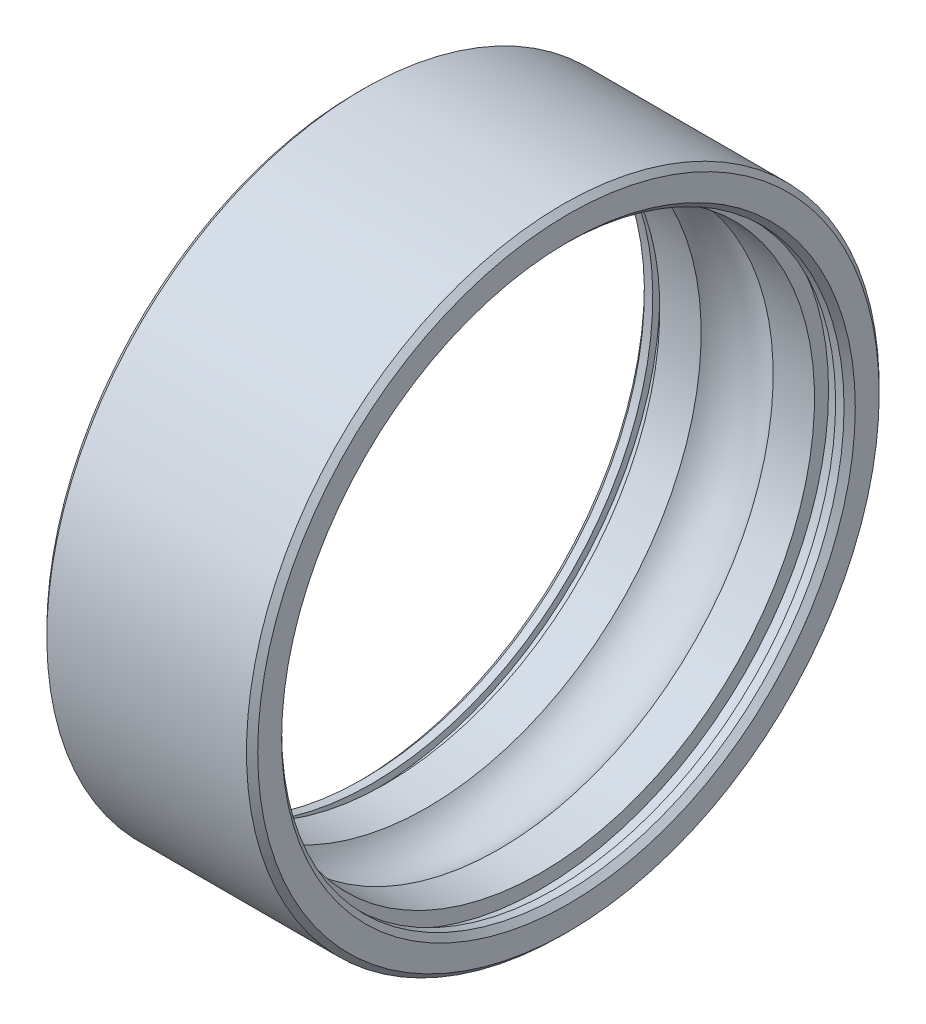
ISO-10303-21;
HEADER;
FILE_DESCRIPTION(('STEP AP214'),'2;1');
FILE_NAME('part.step','',(''),(''),'','','');
FILE_SCHEMA(('AUTOMOTIVE_DESIGN { 1 0 10303 214 1 1 1 1 }'));
ENDSEC;
DATA;
#1=APPLICATION_CONTEXT('core data for automotive mechanical design processes');
#2=APPLICATION_PROTOCOL_DEFINITION('international standard','automotive_design',2000,#1);
#3=PRODUCT_CONTEXT('',#1,'mechanical');
#4=PRODUCT('Part','Part','',(#3));
#5=PRODUCT_RELATED_PRODUCT_CATEGORY('part','',(#4));
#6=PRODUCT_DEFINITION_FORMATION('','',#4);
#7=PRODUCT_DEFINITION_CONTEXT('part definition',#1,'design');
#8=PRODUCT_DEFINITION('design','',#6,#7);
#9=PRODUCT_DEFINITION_SHAPE('','',#8);
#10=(LENGTH_UNIT() NAMED_UNIT(*) SI_UNIT(.MILLI.,.METRE.));
#11=(NAMED_UNIT(*) PLANE_ANGLE_UNIT() SI_UNIT($,.RADIAN.));
#12=(NAMED_UNIT(*) SI_UNIT($,.STERADIAN.) SOLID_ANGLE_UNIT());
#13=UNCERTAINTY_MEASURE_WITH_UNIT(LENGTH_MEASURE(1.E-05),#10,'distance_accuracy_value','');
#14=(GEOMETRIC_REPRESENTATION_CONTEXT(3) GLOBAL_UNCERTAINTY_ASSIGNED_CONTEXT((#13)) GLOBAL_UNIT_ASSIGNED_CONTEXT((#10,
#11,#12)) REPRESENTATION_CONTEXT('',''));
#15=CARTESIAN_POINT('',(0.,0.,0.));
#16=DIRECTION('',(0.,0.,1.));
#17=DIRECTION('',(1.,0.,0.));
#18=AXIS2_PLACEMENT_3D('',#15,#16,#17);
#19=CARTESIAN_POINT('',(1.3,-4.09999999999999,0.));
#20=DIRECTION('',(-1.,0.,0.));
#21=DIRECTION('',(0.,-1.,0.));
#22=AXIS2_PLACEMENT_3D('',#19,#20,#21);
#23=PLANE('',#22);
#24=CARTESIAN_POINT('',(1.3,0.,0.));
#25=DIRECTION('',(-1.,0.,0.));
#26=DIRECTION('',(0.,-1.,0.));
#27=AXIS2_PLACEMENT_3D('',#24,#25,#26);
#28=CIRCLE('',#27,4.09999999999999);
#29=CARTESIAN_POINT('',(1.3,-4.09999999999999,0.));
#30=VERTEX_POINT('',#29);
#31=EDGE_CURVE('E67',#30,#30,#28,.T.);
#32=ORIENTED_EDGE('',*,*,#31,.T.);
#33=EDGE_LOOP('',(#32));
#34=FACE_BOUND('',#33,.T.);
#35=CARTESIAN_POINT('',(1.3,0.,0.));
#36=DIRECTION('',(-1.,0.,0.));
#37=DIRECTION('',(0.,-1.,0.));
#38=AXIS2_PLACEMENT_3D('',#35,#36,#37);
#39=CIRCLE('',#38,4.);
#40=CARTESIAN_POINT('',(1.3,-4.,0.));
#41=VERTEX_POINT('',#40);
#42=EDGE_CURVE('E94',#41,#41,#39,.T.);
#43=ORIENTED_EDGE('',*,*,#42,.F.);
#44=EDGE_LOOP('',(#43));
#45=FACE_BOUND('',#44,.T.);
#46=ADVANCED_FACE('F35',(#34,#45),#23,.T.);
#47=CARTESIAN_POINT('',(-6.42901749222422,0.,0.));
#48=DIRECTION('',(-1.,0.,0.));
#49=DIRECTION('',(0.,-1.,0.));
#50=AXIS2_PLACEMENT_3D('',#47,#48,#49);
#51=CYLINDRICAL_SURFACE('',#50,4.1);
#52=CARTESIAN_POINT('',(1.1,0.,0.));
#53=DIRECTION('',(-1.,0.,0.));
#54=DIRECTION('',(0.,-1.,0.));
#55=AXIS2_PLACEMENT_3D('',#52,#53,#54);
#56=CIRCLE('',#55,4.1);
#57=CARTESIAN_POINT('',(1.1,-4.1,0.));
#58=VERTEX_POINT('',#57);
#59=EDGE_CURVE('E70',#58,#58,#56,.T.);
#60=ORIENTED_EDGE('',*,*,#59,.T.);
#61=EDGE_LOOP('',(#60));
#62=FACE_BOUND('',#61,.T.);
#63=ORIENTED_EDGE('',*,*,#31,.F.);
#64=EDGE_LOOP('',(#63));
#65=FACE_BOUND('',#64,.T.);
#66=ADVANCED_FACE('F101',(#62,#65),#51,.F.);
#67=CARTESIAN_POINT('',(1.1,-3.9,0.));
#68=DIRECTION('',(1.,0.,0.));
#69=DIRECTION('',(0.,1.,0.));
#70=AXIS2_PLACEMENT_3D('',#67,#68,#69);
#71=PLANE('',#70);
#72=CARTESIAN_POINT('',(1.1,0.,0.));
#73=DIRECTION('',(-1.,0.,0.));
#74=DIRECTION('',(0.,-1.,0.));
#75=AXIS2_PLACEMENT_3D('',#72,#73,#74);
#76=CIRCLE('',#75,3.9);
#77=CARTESIAN_POINT('',(1.1,-3.9,0.));
#78=VERTEX_POINT('',#77);
#79=EDGE_CURVE('E73',#78,#78,#76,.T.);
#80=ORIENTED_EDGE('',*,*,#79,.T.);
#81=EDGE_LOOP('',(#80));
#82=FACE_BOUND('',#81,.T.);
#83=ORIENTED_EDGE('',*,*,#59,.F.);
#84=EDGE_LOOP('',(#83));
#85=FACE_BOUND('',#84,.T.);
#86=ADVANCED_FACE('F107',(#82,#85),#71,.T.);
#87=CARTESIAN_POINT('',(-6.42901749222422,0.,0.));
#88=DIRECTION('',(-1.,0.,0.));
#89=DIRECTION('',(0.,-1.,0.));
#90=AXIS2_PLACEMENT_3D('',#87,#88,#89);
#91=CYLINDRICAL_SURFACE('',#90,3.9);
#92=CARTESIAN_POINT('',(0.512347538297978,0.,0.));
#93=DIRECTION('',(-1.,0.,0.));
#94=DIRECTION('',(0.,-1.,0.));
#95=AXIS2_PLACEMENT_3D('',#92,#93,#94);
#96=CIRCLE('',#95,3.9);
#97=CARTESIAN_POINT('',(0.512347538297979,-3.9,0.));
#98=VERTEX_POINT('',#97);
#99=EDGE_CURVE('E76',#98,#98,#96,.T.);
#100=ORIENTED_EDGE('',*,*,#99,.T.);
#101=EDGE_LOOP('',(#100));
#102=FACE_BOUND('',#101,.T.);
#103=ORIENTED_EDGE('',*,*,#79,.F.);
#104=EDGE_LOOP('',(#103));
#105=FACE_BOUND('',#104,.T.);
#106=ADVANCED_FACE('F169',(#102,#105),#91,.F.);
#107=CARTESIAN_POINT('',(0.,0.,0.));
#108=DIRECTION('',(-1.,0.,0.));
#109=DIRECTION('',(0.,-1.,0.));
#110=AXIS2_PLACEMENT_3D('',#107,#108,#109);
#111=TOROIDAL_SURFACE('',#110,3.5,0.65);
#112=CARTESIAN_POINT('',(-0.51234753829798,0.,0.));
#113=DIRECTION('',(-1.,0.,0.));
#114=DIRECTION('',(0.,-1.,0.));
#115=AXIS2_PLACEMENT_3D('',#112,#113,#114);
#116=CIRCLE('',#115,3.9);
#117=CARTESIAN_POINT('',(-0.512347538297979,-3.9,0.));
#118=VERTEX_POINT('',#117);
#119=EDGE_CURVE('E79',#118,#118,#116,.T.);
#120=ORIENTED_EDGE('',*,*,#119,.T.);
#121=EDGE_LOOP('',(#120));
#122=FACE_BOUND('',#121,.T.);
#123=ORIENTED_EDGE('',*,*,#99,.F.);
#124=EDGE_LOOP('',(#123));
#125=FACE_BOUND('',#124,.T.);
#126=ADVANCED_FACE('F165',(#122,#125),#111,.F.);
#127=CARTESIAN_POINT('',(-6.42901749222422,0.,0.));
#128=DIRECTION('',(-1.,0.,0.));
#129=DIRECTION('',(0.,-1.,0.));
#130=AXIS2_PLACEMENT_3D('',#127,#128,#129);
#131=CYLINDRICAL_SURFACE('',#130,3.9);
#132=CARTESIAN_POINT('',(-1.1,0.,0.));
#133=DIRECTION('',(-1.,0.,0.));
#134=DIRECTION('',(0.,-1.,0.));
#135=AXIS2_PLACEMENT_3D('',#132,#133,#134);
#136=CIRCLE('',#135,3.9);
#137=CARTESIAN_POINT('',(-1.1,-3.9,0.));
#138=VERTEX_POINT('',#137);
#139=EDGE_CURVE('E82',#138,#138,#136,.T.);
#140=ORIENTED_EDGE('',*,*,#139,.T.);
#141=EDGE_LOOP('',(#140));
#142=FACE_BOUND('',#141,.T.);
#143=ORIENTED_EDGE('',*,*,#119,.F.);
#144=EDGE_LOOP('',(#143));
#145=FACE_BOUND('',#144,.T.);
#146=ADVANCED_FACE('F161',(#142,#145),#131,.F.);
#147=CARTESIAN_POINT('',(-1.1,-3.9,0.));
#148=DIRECTION('',(-1.,0.,0.));
#149=DIRECTION('',(0.,-1.,0.));
#150=AXIS2_PLACEMENT_3D('',#147,#148,#149);
#151=PLANE('',#150);
#152=CARTESIAN_POINT('',(-1.1,0.,0.));
#153=DIRECTION('',(-1.,0.,0.));
#154=DIRECTION('',(0.,-1.,0.));
#155=AXIS2_PLACEMENT_3D('',#152,#153,#154);
#156=CIRCLE('',#155,4.1);
#157=CARTESIAN_POINT('',(-1.1,-4.1,0.));
#158=VERTEX_POINT('',#157);
#159=EDGE_CURVE('E85',#158,#158,#156,.T.);
#160=ORIENTED_EDGE('',*,*,#159,.T.);
#161=EDGE_LOOP('',(#160));
#162=FACE_BOUND('',#161,.T.);
#163=ORIENTED_EDGE('',*,*,#139,.F.);
#164=EDGE_LOOP('',(#163));
#165=FACE_BOUND('',#164,.T.);
#166=ADVANCED_FACE('F157',(#162,#165),#151,.T.);
#167=CARTESIAN_POINT('',(-6.42901749222422,0.,0.));
#168=DIRECTION('',(-1.,0.,0.));
#169=DIRECTION('',(0.,-1.,0.));
#170=AXIS2_PLACEMENT_3D('',#167,#168,#169);
#171=CYLINDRICAL_SURFACE('',#170,4.1);
#172=CARTESIAN_POINT('',(-1.3,0.,0.));
#173=DIRECTION('',(-1.,0.,0.));
#174=DIRECTION('',(0.,-1.,0.));
#175=AXIS2_PLACEMENT_3D('',#172,#173,#174);
#176=CIRCLE('',#175,4.09999999999999);
#177=CARTESIAN_POINT('',(-1.3,-4.09999999999999,0.));
#178=VERTEX_POINT('',#177);
#179=EDGE_CURVE('E88',#178,#178,#176,.T.);
#180=ORIENTED_EDGE('',*,*,#179,.T.);
#181=EDGE_LOOP('',(#180));
#182=FACE_BOUND('',#181,.T.);
#183=ORIENTED_EDGE('',*,*,#159,.F.);
#184=EDGE_LOOP('',(#183));
#185=FACE_BOUND('',#184,.T.);
#186=ADVANCED_FACE('F153',(#182,#185),#171,.F.);
#187=CARTESIAN_POINT('',(-1.3,-4.09999999999999,0.));
#188=DIRECTION('',(1.,0.,0.));
#189=DIRECTION('',(0.,1.,0.));
#190=AXIS2_PLACEMENT_3D('',#187,#188,#189);
#191=PLANE('',#190);
#192=CARTESIAN_POINT('',(-1.3,0.,0.));
#193=DIRECTION('',(-1.,0.,0.));
#194=DIRECTION('',(0.,-1.,0.));
#195=AXIS2_PLACEMENT_3D('',#192,#193,#194);
#196=CIRCLE('',#195,4.);
#197=CARTESIAN_POINT('',(-1.3,-4.,0.));
#198=VERTEX_POINT('',#197);
#199=EDGE_CURVE('E91',#198,#198,#196,.T.);
#200=ORIENTED_EDGE('',*,*,#199,.T.);
#201=EDGE_LOOP('',(#200));
#202=FACE_BOUND('',#201,.T.);
#203=ORIENTED_EDGE('',*,*,#179,.F.);
#204=EDGE_LOOP('',(#203));
#205=FACE_BOUND('',#204,.T.);
#206=ADVANCED_FACE('F149',(#202,#205),#191,.T.);
#207=CARTESIAN_POINT('',(-6.42901749222422,0.,0.));
#208=DIRECTION('',(-1.,0.,0.));
#209=DIRECTION('',(0.,-1.,0.));
#210=AXIS2_PLACEMENT_3D('',#207,#208,#209);
#211=CYLINDRICAL_SURFACE('',#210,4.);
#212=CARTESIAN_POINT('',(-1.42,0.,0.));
#213=DIRECTION('',(-1.,0.,0.));
#214=DIRECTION('',(0.,-1.,0.));
#215=AXIS2_PLACEMENT_3D('',#212,#213,#214);
#216=CIRCLE('',#215,4.);
#217=CARTESIAN_POINT('',(-1.42,-4.,0.));
#218=VERTEX_POINT('',#217);
#219=EDGE_CURVE('E55',#218,#218,#216,.T.);
#220=ORIENTED_EDGE('',*,*,#219,.T.);
#221=EDGE_LOOP('',(#220));
#222=FACE_BOUND('',#221,.T.);
#223=ORIENTED_EDGE('',*,*,#199,.F.);
#224=EDGE_LOOP('',(#223));
#225=FACE_BOUND('',#224,.T.);
#226=ADVANCED_FACE('F145',(#222,#225),#211,.F.);
#227=CARTESIAN_POINT('',(-1.5,-4.,0.));
#228=DIRECTION('',(-1.,0.,0.));
#229=DIRECTION('',(0.,-1.,0.));
#230=AXIS2_PLACEMENT_3D('',#227,#228,#229);
#231=PLANE('',#230);
#232=CARTESIAN_POINT('',(-1.5,0.,0.));
#233=DIRECTION('',(-1.,0.,0.));
#234=DIRECTION('',(0.,-1.,0.));
#235=AXIS2_PLACEMENT_3D('',#232,#233,#234);
#236=CIRCLE('',#235,4.08);
#237=CARTESIAN_POINT('',(-1.5,-4.07999999999999,0.));
#238=VERTEX_POINT('',#237);
#239=EDGE_CURVE('E46',#238,#238,#236,.F.);
#240=ORIENTED_EDGE('',*,*,#239,.T.);
#241=EDGE_LOOP('',(#240));
#242=FACE_BOUND('',#241,.T.);
#243=CARTESIAN_POINT('',(-1.5,0.,0.));
#244=DIRECTION('',(-1.,0.,0.));
#245=DIRECTION('',(0.,-1.,0.));
#246=AXIS2_PLACEMENT_3D('',#243,#244,#245);
#247=CIRCLE('',#246,4.42);
#248=CARTESIAN_POINT('',(-1.5,-4.42,0.));
#249=VERTEX_POINT('',#248);
#250=EDGE_CURVE('E50',#249,#249,#247,.T.);
#251=ORIENTED_EDGE('',*,*,#250,.T.);
#252=EDGE_LOOP('',(#251));
#253=FACE_BOUND('',#252,.T.);
#254=ADVANCED_FACE('F140',(#242,#253),#231,.T.);
#255=CARTESIAN_POINT('',(-6.42901749222422,0.,0.));
#256=DIRECTION('',(-1.,0.,0.));
#257=DIRECTION('',(0.,-1.,0.));
#258=AXIS2_PLACEMENT_3D('',#255,#256,#257);
#259=CYLINDRICAL_SURFACE('',#258,4.5);
#260=CARTESIAN_POINT('',(1.42,0.,0.));
#261=DIRECTION('',(1.,0.,0.));
#262=DIRECTION('',(0.,1.,0.));
#263=AXIS2_PLACEMENT_3D('',#260,#261,#262);
#264=CIRCLE('',#263,4.5);
#265=CARTESIAN_POINT('',(1.42,4.5,0.));
#266=VERTEX_POINT('',#265);
#267=EDGE_CURVE('E10',#266,#266,#264,.F.);
#268=ORIENTED_EDGE('',*,*,#267,.T.);
#269=EDGE_LOOP('',(#268));
#270=FACE_BOUND('',#269,.T.);
#271=CARTESIAN_POINT('',(-1.42,0.,0.));
#272=DIRECTION('',(-1.,0.,0.));
#273=DIRECTION('',(0.,-1.,0.));
#274=AXIS2_PLACEMENT_3D('',#271,#272,#273);
#275=CIRCLE('',#274,4.5);
#276=CARTESIAN_POINT('',(-1.42,-4.5,0.));
#277=VERTEX_POINT('',#276);
#278=EDGE_CURVE('E42',#277,#277,#275,.F.);
#279=ORIENTED_EDGE('',*,*,#278,.T.);
#280=EDGE_LOOP('',(#279));
#281=FACE_BOUND('',#280,.T.);
#282=ADVANCED_FACE('F131',(#270,#281),#259,.T.);
#283=CARTESIAN_POINT('',(1.5,-4.,0.));
#284=DIRECTION('',(1.,0.,0.));
#285=DIRECTION('',(0.,1.,0.));
#286=AXIS2_PLACEMENT_3D('',#283,#284,#285);
#287=PLANE('',#286);
#288=CARTESIAN_POINT('',(1.5,0.,0.));
#289=DIRECTION('',(1.,0.,0.));
#290=DIRECTION('',(0.,1.,0.));
#291=AXIS2_PLACEMENT_3D('',#288,#289,#290);
#292=CIRCLE('',#291,4.07999999999999);
#293=CARTESIAN_POINT('',(1.5,4.08,0.));
#294=VERTEX_POINT('',#293);
#295=EDGE_CURVE('E61',#294,#294,#292,.F.);
#296=ORIENTED_EDGE('',*,*,#295,.T.);
#297=EDGE_LOOP('',(#296));
#298=FACE_BOUND('',#297,.T.);
#299=CARTESIAN_POINT('',(1.5,0.,0.));
#300=DIRECTION('',(1.,0.,0.));
#301=DIRECTION('',(0.,1.,0.));
#302=AXIS2_PLACEMENT_3D('',#299,#300,#301);
#303=CIRCLE('',#302,4.42);
#304=CARTESIAN_POINT('',(1.5,4.42,0.));
#305=VERTEX_POINT('',#304);
#306=EDGE_CURVE('E64',#305,#305,#303,.T.);
#307=ORIENTED_EDGE('',*,*,#306,.T.);
#308=EDGE_LOOP('',(#307));
#309=FACE_BOUND('',#308,.T.);
#310=ADVANCED_FACE('F129',(#298,#309),#287,.T.);
#311=CARTESIAN_POINT('',(-6.42901749222422,0.,0.));
#312=DIRECTION('',(-1.,0.,0.));
#313=DIRECTION('',(0.,-1.,0.));
#314=AXIS2_PLACEMENT_3D('',#311,#312,#313);
#315=CYLINDRICAL_SURFACE('',#314,4.);
#316=CARTESIAN_POINT('',(1.42,0.,0.));
#317=DIRECTION('',(1.,0.,0.));
#318=DIRECTION('',(0.,1.,0.));
#319=AXIS2_PLACEMENT_3D('',#316,#317,#318);
#320=CIRCLE('',#319,4.);
#321=CARTESIAN_POINT('',(1.42,4.,0.));
#322=VERTEX_POINT('',#321);
#323=EDGE_CURVE('E58',#322,#322,#320,.T.);
#324=ORIENTED_EDGE('',*,*,#323,.T.);
#325=EDGE_LOOP('',(#324));
#326=FACE_BOUND('',#325,.T.);
#327=ORIENTED_EDGE('',*,*,#42,.T.);
#328=EDGE_LOOP('',(#327));
#329=FACE_BOUND('',#328,.T.);
#330=ADVANCED_FACE('F98',(#326,#329),#315,.F.);
#331=CARTESIAN_POINT('',(1.5,0.,0.));
#332=DIRECTION('',(1.,0.,0.));
#333=DIRECTION('',(0.,1.,0.));
#334=AXIS2_PLACEMENT_3D('',#331,#332,#333);
#335=CONICAL_SURFACE('',#334,4.07999999999999,0.785398163397448);
#336=ORIENTED_EDGE('',*,*,#323,.F.);
#337=EDGE_LOOP('',(#336));
#338=FACE_BOUND('',#337,.T.);
#339=ORIENTED_EDGE('',*,*,#295,.F.);
#340=EDGE_LOOP('',(#339));
#341=FACE_BOUND('',#340,.T.);
#342=ADVANCED_FACE('F112',(#338,#341),#335,.F.);
#343=CARTESIAN_POINT('',(-1.42,0.,0.));
#344=DIRECTION('',(-1.,0.,0.));
#345=DIRECTION('',(0.,-1.,0.));
#346=AXIS2_PLACEMENT_3D('',#343,#344,#345);
#347=CONICAL_SURFACE('',#346,4.,0.785398163397443);
#348=CARTESIAN_POINT('',(-1.5,-4.07999999999999,0.));
#349=CARTESIAN_POINT('',(-1.49916666666667,-4.07916666666666,0.));
#350=CARTESIAN_POINT('',(-1.49833333333333,-4.07833333333333,0.));
#351=CARTESIAN_POINT('',(-1.49666666666667,-4.07666666666666,0.));
#352=CARTESIAN_POINT('',(-1.49583333333333,-4.07583333333333,0.));
#353=CARTESIAN_POINT('',(-1.49416666666667,-4.07416666666666,0.));
#354=CARTESIAN_POINT('',(-1.49333333333333,-4.07333333333333,0.));
#355=CARTESIAN_POINT('',(-1.49166666666667,-4.07166666666666,0.));
#356=CARTESIAN_POINT('',(-1.49083333333333,-4.07083333333333,0.));
#357=CARTESIAN_POINT('',(-1.48916666666667,-4.06916666666666,0.));
#358=CARTESIAN_POINT('',(-1.48833333333333,-4.06833333333333,0.));
#359=CARTESIAN_POINT('',(-1.48666666666667,-4.06666666666666,0.));
#360=CARTESIAN_POINT('',(-1.48583333333333,-4.06583333333333,0.));
#361=CARTESIAN_POINT('',(-1.48416666666667,-4.06416666666666,0.));
#362=CARTESIAN_POINT('',(-1.48333333333333,-4.06333333333333,0.));
#363=CARTESIAN_POINT('',(-1.48166666666667,-4.06166666666666,0.));
#364=CARTESIAN_POINT('',(-1.48083333333333,-4.06083333333333,0.));
#365=CARTESIAN_POINT('',(-1.47916666666667,-4.05916666666666,0.));
#366=CARTESIAN_POINT('',(-1.47833333333333,-4.05833333333333,0.));
#367=CARTESIAN_POINT('',(-1.47666666666667,-4.05666666666666,0.));
#368=CARTESIAN_POINT('',(-1.47583333333333,-4.05583333333333,0.));
#369=CARTESIAN_POINT('',(-1.47416666666667,-4.05416666666666,0.));
#370=CARTESIAN_POINT('',(-1.47333333333333,-4.05333333333333,0.));
#371=CARTESIAN_POINT('',(-1.47166666666667,-4.05166666666666,0.));
#372=CARTESIAN_POINT('',(-1.47083333333333,-4.05083333333333,0.));
#373=CARTESIAN_POINT('',(-1.46916666666667,-4.04916666666666,0.));
#374=CARTESIAN_POINT('',(-1.46833333333334,-4.04833333333333,0.));
#375=CARTESIAN_POINT('',(-1.46666666666667,-4.04666666666666,0.));
#376=CARTESIAN_POINT('',(-1.46583333333334,-4.04583333333333,0.));
#377=CARTESIAN_POINT('',(-1.46416666666667,-4.04416666666666,0.));
#378=CARTESIAN_POINT('',(-1.46333333333333,-4.04333333333333,0.));
#379=CARTESIAN_POINT('',(-1.46166666666667,-4.04166666666666,0.));
#380=CARTESIAN_POINT('',(-1.46083333333333,-4.04083333333333,0.));
#381=CARTESIAN_POINT('',(-1.45916666666667,-4.03916666666666,0.));
#382=CARTESIAN_POINT('',(-1.45833333333334,-4.03833333333333,0.));
#383=CARTESIAN_POINT('',(-1.45666666666667,-4.03666666666666,0.));
#384=CARTESIAN_POINT('',(-1.45583333333334,-4.03583333333333,0.));
#385=CARTESIAN_POINT('',(-1.45416666666667,-4.03416666666666,0.));
#386=CARTESIAN_POINT('',(-1.45333333333334,-4.03333333333333,0.));
#387=CARTESIAN_POINT('',(-1.45166666666667,-4.03166666666666,0.));
#388=CARTESIAN_POINT('',(-1.45083333333333,-4.03083333333333,0.));
#389=CARTESIAN_POINT('',(-1.44916666666667,-4.02916666666666,0.));
#390=CARTESIAN_POINT('',(-1.44833333333334,-4.02833333333333,0.));
#391=CARTESIAN_POINT('',(-1.44666666666667,-4.02666666666666,0.));
#392=CARTESIAN_POINT('',(-1.44583333333334,-4.02583333333333,0.));
#393=CARTESIAN_POINT('',(-1.44416666666667,-4.02416666666666,0.));
#394=CARTESIAN_POINT('',(-1.44333333333334,-4.02333333333333,0.));
#395=CARTESIAN_POINT('',(-1.44166666666667,-4.02166666666666,0.));
#396=CARTESIAN_POINT('',(-1.44083333333334,-4.02083333333333,0.));
#397=CARTESIAN_POINT('',(-1.43916666666667,-4.01916666666666,0.));
#398=CARTESIAN_POINT('',(-1.43833333333334,-4.01833333333333,0.));
#399=CARTESIAN_POINT('',(-1.43666666666667,-4.01666666666666,0.));
#400=CARTESIAN_POINT('',(-1.43583333333334,-4.01583333333333,0.));
#401=CARTESIAN_POINT('',(-1.43416666666667,-4.01416666666666,0.));
#402=CARTESIAN_POINT('',(-1.43333333333334,-4.01333333333333,0.));
#403=CARTESIAN_POINT('',(-1.43166666666667,-4.01166666666666,0.));
#404=CARTESIAN_POINT('',(-1.43083333333334,-4.01083333333333,0.));
#405=CARTESIAN_POINT('',(-1.42916666666667,-4.00916666666666,0.));
#406=CARTESIAN_POINT('',(-1.42833333333334,-4.00833333333333,0.));
#407=CARTESIAN_POINT('',(-1.42666666666667,-4.00666666666666,0.));
#408=CARTESIAN_POINT('',(-1.42583333333334,-4.00583333333333,0.));
#409=CARTESIAN_POINT('',(-1.42416666666667,-4.00416666666666,0.));
#410=CARTESIAN_POINT('',(-1.42333333333334,-4.00333333333333,0.));
#411=CARTESIAN_POINT('',(-1.42166666666667,-4.00166666666666,0.));
#412=CARTESIAN_POINT('',(-1.42083333333334,-4.00083333333333,0.));
#413=CARTESIAN_POINT('',(-1.42,-4.,0.));
#414=B_SPLINE_CURVE_WITH_KNOTS('',3,(#348,#349,#350,#351,#352,#353,#354,#355,#356,#357,#358,
#359,#360,#361,#362,#363,#364,#365,#366,#367,#368,#369,#370,#371,#372,#373,#374,#375,#376,#377,
#378,#379,#380,#381,#382,#383,#384,#385,#386,#387,#388,#389,#390,#391,#392,#393,#394,#395,#396,
#397,#398,#399,#400,#401,#402,#403,#404,#405,#406,#407,#408,#409,#410,#411,#412,#413),
.UNSPECIFIED.,.F.,.F.,(4,2,2,2,2,2,2,2,2,2,2,2,2,2,2,2,2,2,2,2,2,2,2,2,2,2,2,2,2,2,2,2,4),(0.,
0.00353553390593259,0.00707106781186519,0.0106066017177985,0.0141421356237311,
0.0176776695296637,0.0212132034355965,0.0247487373415291,0.0282842712474617,0.0318198051533944,
0.035355339059327,0.0388908729652596,0.0424264068711923,0.0459619407771249,0.0494974746830575,
0.0530330085889903,0.0565685424949229,0.0601040764008555,0.0636396103067882,0.0671751442127208,
0.0707106781186534,0.0742462120245868,0.0777817459305194,0.081317279836452,0.0848528137423847,
0.0883883476483173,0.0919238815542499,0.0954594154601826,0.0989949493661152,0.102530483272048,
0.106066017177981,0.109601551083913,0.113137084989846),.UNSPECIFIED.);
#415=EDGE_CURVE('BSEAM115',#238,#218,#414,.T.);
#416=ORIENTED_EDGE('',*,*,#239,.F.);
#417=ORIENTED_EDGE('',*,*,#219,.F.);
#418=ORIENTED_EDGE('',*,*,#415,.T.);
#419=ORIENTED_EDGE('',*,*,#415,.F.);
#420=EDGE_LOOP('',(#416,#418,#417,#419));
#421=FACE_BOUND('',#420,.T.);
#422=ADVANCED_FACE('F115',(#421),#347,.F.);
#423=CARTESIAN_POINT('',(1.42,0.,0.));
#424=DIRECTION('',(-1.,0.,0.));
#425=DIRECTION('',(0.,-1.,0.));
#426=AXIS2_PLACEMENT_3D('',#423,#424,#425);
#427=CONICAL_SURFACE('',#426,4.5,0.785398163397448);
#428=ORIENTED_EDGE('',*,*,#306,.F.);
#429=EDGE_LOOP('',(#428));
#430=FACE_BOUND('',#429,.T.);
#431=ORIENTED_EDGE('',*,*,#267,.F.);
#432=EDGE_LOOP('',(#431));
#433=FACE_BOUND('',#432,.T.);
#434=ADVANCED_FACE('F118',(#430,#433),#427,.T.);
#435=CARTESIAN_POINT('',(-1.5,0.,0.));
#436=DIRECTION('',(1.,0.,0.));
#437=DIRECTION('',(0.,1.,0.));
#438=AXIS2_PLACEMENT_3D('',#435,#436,#437);
#439=CONICAL_SURFACE('',#438,4.42,0.785398163397448);
#440=ORIENTED_EDGE('',*,*,#278,.F.);
#441=EDGE_LOOP('',(#440));
#442=FACE_BOUND('',#441,.T.);
#443=ORIENTED_EDGE('',*,*,#250,.F.);
#444=EDGE_LOOP('',(#443));
#445=FACE_BOUND('',#444,.T.);
#446=ADVANCED_FACE('F37',(#442,#445),#439,.T.);
#447=CLOSED_SHELL('',(#46,#66,#86,#106,#126,#146,#166,#186,#206,#226,#254,#282,#310,#330,#342,
#422,#434,#446));
#448=MANIFOLD_SOLID_BREP('B2',#447);
#449=ADVANCED_BREP_SHAPE_REPRESENTATION('',(#18,#448),#14);
#450=SHAPE_DEFINITION_REPRESENTATION(#9,#449);
ENDSEC;
END-ISO-10303-21;
